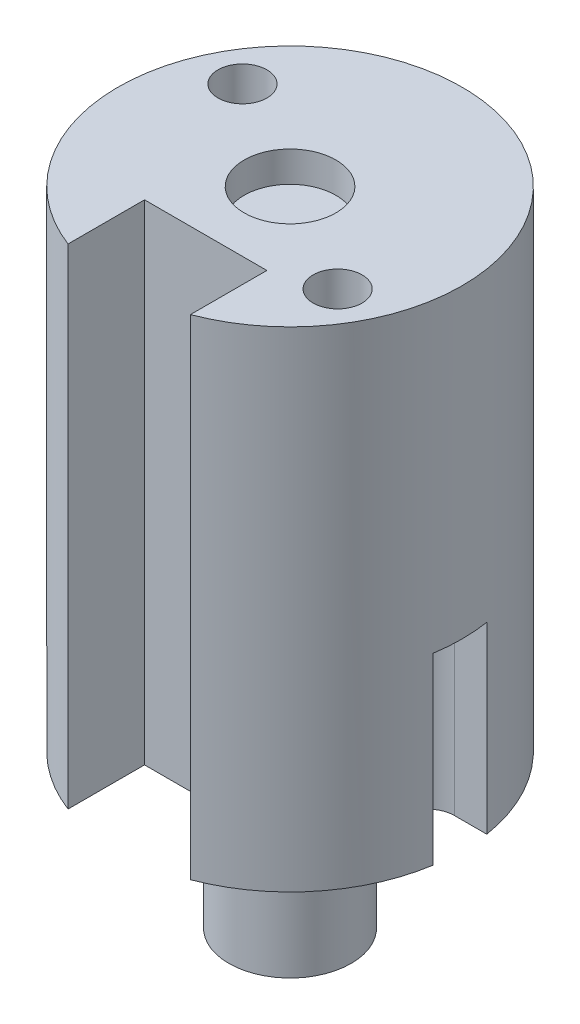
ISO-10303-21;
HEADER;
FILE_DESCRIPTION(('STEP AP214'),'2;1');
FILE_NAME('part.step','',(''),(''),'','','');
FILE_SCHEMA(('AUTOMOTIVE_DESIGN { 1 0 10303 214 1 1 1 1 }'));
ENDSEC;
DATA;
#1=APPLICATION_CONTEXT('core data for automotive mechanical design processes');
#2=APPLICATION_PROTOCOL_DEFINITION('international standard','automotive_design',2000,#1);
#3=PRODUCT_CONTEXT('',#1,'mechanical');
#4=PRODUCT('Part','Part','',(#3));
#5=PRODUCT_RELATED_PRODUCT_CATEGORY('part','',(#4));
#6=PRODUCT_DEFINITION_FORMATION('','',#4);
#7=PRODUCT_DEFINITION_CONTEXT('part definition',#1,'design');
#8=PRODUCT_DEFINITION('design','',#6,#7);
#9=PRODUCT_DEFINITION_SHAPE('','',#8);
#10=(LENGTH_UNIT() NAMED_UNIT(*) SI_UNIT(.MILLI.,.METRE.));
#11=(NAMED_UNIT(*) PLANE_ANGLE_UNIT() SI_UNIT($,.RADIAN.));
#12=(NAMED_UNIT(*) SI_UNIT($,.STERADIAN.) SOLID_ANGLE_UNIT());
#13=UNCERTAINTY_MEASURE_WITH_UNIT(LENGTH_MEASURE(1.E-05),#10,'distance_accuracy_value','');
#14=(GEOMETRIC_REPRESENTATION_CONTEXT(3) GLOBAL_UNCERTAINTY_ASSIGNED_CONTEXT((#13)) GLOBAL_UNIT_ASSIGNED_CONTEXT((#10,
#11,#12)) REPRESENTATION_CONTEXT('',''));
#15=CARTESIAN_POINT('',(0.,0.,0.));
#16=DIRECTION('',(0.,0.,1.));
#17=DIRECTION('',(1.,0.,0.));
#18=AXIS2_PLACEMENT_3D('',#15,#16,#17);
#19=CARTESIAN_POINT('',(0.,32.,0.));
#20=DIRECTION('',(0.,-1.,0.));
#21=DIRECTION('',(0.,0.,-1.));
#22=AXIS2_PLACEMENT_3D('',#19,#20,#21);
#23=CYLINDRICAL_SURFACE('',#22,11.25);
#24=CARTESIAN_POINT('',(0.,0.,0.));
#25=DIRECTION('',(0.,1.,0.));
#26=DIRECTION('',(0.,0.,1.));
#27=AXIS2_PLACEMENT_3D('',#24,#25,#26);
#28=CIRCLE('',#27,11.25);
#29=CARTESIAN_POINT('',(11.1130553854464,0.,-1.75));
#30=VERTEX_POINT('',#29);
#31=CARTESIAN_POINT('',(-11.1130553854464,0.,-1.75));
#32=VERTEX_POINT('',#31);
#33=EDGE_CURVE('E328',#30,#32,#28,.T.);
#34=ORIENTED_EDGE('',*,*,#33,.T.);
#35=DIRECTION('',(0.,-1.,0.));
#36=VECTOR('',#35,1.);
#37=CARTESIAN_POINT('',(-11.1130553854464,12.,-1.75));
#38=LINE('',#37,#36);
#39=CARTESIAN_POINT('',(-11.1130553854464,12.,-1.75));
#40=VERTEX_POINT('',#39);
#41=EDGE_CURVE('E198',#40,#32,#38,.T.);
#42=ORIENTED_EDGE('',*,*,#41,.F.);
#43=CARTESIAN_POINT('',(0.,12.,0.));
#44=DIRECTION('',(0.,-1.,0.));
#45=DIRECTION('',(0.,0.,-1.));
#46=AXIS2_PLACEMENT_3D('',#43,#44,#45);
#47=CIRCLE('',#46,11.25);
#48=CARTESIAN_POINT('',(-11.1130553854464,12.,1.75));
#49=VERTEX_POINT('',#48);
#50=EDGE_CURVE('E170',#49,#40,#47,.T.);
#51=ORIENTED_EDGE('',*,*,#50,.F.);
#52=DIRECTION('',(0.,-1.,0.));
#53=VECTOR('',#52,1.);
#54=CARTESIAN_POINT('',(-11.1130553854464,12.,1.75));
#55=LINE('',#54,#53);
#56=CARTESIAN_POINT('',(-11.1130553854464,0.,1.75));
#57=VERTEX_POINT('',#56);
#58=EDGE_CURVE('E166',#49,#57,#55,.T.);
#59=ORIENTED_EDGE('',*,*,#58,.T.);
#60=CARTESIAN_POINT('',(-4.,0.,10.5148704224065));
#61=VERTEX_POINT('',#60);
#62=EDGE_CURVE('E318',#57,#61,#28,.T.);
#63=ORIENTED_EDGE('',*,*,#62,.T.);
#64=DIRECTION('',(0.,1.,0.));
#65=VECTOR('',#64,1.);
#66=CARTESIAN_POINT('',(-4.,-10.,10.5148704224065));
#67=LINE('',#66,#65);
#68=CARTESIAN_POINT('',(-4.,32.,10.5148704224065));
#69=VERTEX_POINT('',#68);
#70=EDGE_CURVE('E258',#61,#69,#67,.T.);
#71=ORIENTED_EDGE('',*,*,#70,.T.);
#72=CARTESIAN_POINT('',(0.,32.,0.));
#73=DIRECTION('',(0.,1.,0.));
#74=DIRECTION('',(0.,0.,1.));
#75=AXIS2_PLACEMENT_3D('',#72,#73,#74);
#76=CIRCLE('',#75,11.25);
#77=CARTESIAN_POINT('',(4.,32.,10.5148704224065));
#78=VERTEX_POINT('',#77);
#79=EDGE_CURVE('E321',#78,#69,#76,.T.);
#80=ORIENTED_EDGE('',*,*,#79,.F.);
#81=DIRECTION('',(0.,1.,0.));
#82=VECTOR('',#81,1.);
#83=CARTESIAN_POINT('',(4.,-10.,10.5148704224065));
#84=LINE('',#83,#82);
#85=CARTESIAN_POINT('',(4.,0.,10.5148704224065));
#86=VERTEX_POINT('',#85);
#87=EDGE_CURVE('E255',#86,#78,#84,.T.);
#88=ORIENTED_EDGE('',*,*,#87,.F.);
#89=CARTESIAN_POINT('',(11.1130553854464,0.,1.75));
#90=VERTEX_POINT('',#89);
#91=EDGE_CURVE('E325',#86,#90,#28,.T.);
#92=ORIENTED_EDGE('',*,*,#91,.T.);
#93=DIRECTION('',(0.,-1.,0.));
#94=VECTOR('',#93,1.);
#95=CARTESIAN_POINT('',(11.1130553854464,12.,1.75));
#96=LINE('',#95,#94);
#97=CARTESIAN_POINT('',(11.1130553854464,12.,1.75));
#98=VERTEX_POINT('',#97);
#99=EDGE_CURVE('E223',#98,#90,#96,.T.);
#100=ORIENTED_EDGE('',*,*,#99,.F.);
#101=CARTESIAN_POINT('',(0.,12.,0.));
#102=DIRECTION('',(0.,-1.,0.));
#103=DIRECTION('',(0.,0.,-1.));
#104=AXIS2_PLACEMENT_3D('',#101,#102,#103);
#105=CIRCLE('',#104,11.25);
#106=CARTESIAN_POINT('',(11.1130553854464,12.,-1.75));
#107=VERTEX_POINT('',#106);
#108=EDGE_CURVE('E207',#107,#98,#105,.T.);
#109=ORIENTED_EDGE('',*,*,#108,.F.);
#110=DIRECTION('',(0.,-1.,0.));
#111=VECTOR('',#110,1.);
#112=CARTESIAN_POINT('',(11.1130553854464,12.,-1.75));
#113=LINE('',#112,#111);
#114=EDGE_CURVE('E225',#107,#30,#113,.T.);
#115=ORIENTED_EDGE('',*,*,#114,.T.);
#116=EDGE_LOOP('',(#34,#42,#51,#59,#63,#71,#80,#88,#92,#100,#109,#115));
#117=FACE_BOUND('',#116,.T.);
#118=ADVANCED_FACE('F35',(#117),#23,.T.);
#119=CARTESIAN_POINT('',(0.,32.,0.));
#120=DIRECTION('',(0.,1.,0.));
#121=DIRECTION('',(0.,0.,1.));
#122=AXIS2_PLACEMENT_3D('',#119,#120,#121);
#123=PLANE('',#122);
#124=CARTESIAN_POINT('',(0.,32.,0.));
#125=DIRECTION('',(0.,1.,0.));
#126=DIRECTION('',(0.,0.,1.));
#127=AXIS2_PLACEMENT_3D('',#124,#125,#126);
#128=CIRCLE('',#127,3.);
#129=CARTESIAN_POINT('',(0.,32.,3.));
#130=VERTEX_POINT('',#129);
#131=EDGE_CURVE('E197',#130,#130,#128,.T.);
#132=ORIENTED_EDGE('',*,*,#131,.F.);
#133=EDGE_LOOP('',(#132));
#134=FACE_BOUND('',#133,.T.);
#135=CARTESIAN_POINT('',(-7.36121593216774,32.,-4.24999999999998));
#136=DIRECTION('',(0.,1.,0.));
#137=DIRECTION('',(0.,0.,1.));
#138=AXIS2_PLACEMENT_3D('',#135,#136,#137);
#139=CIRCLE('',#138,1.6);
#140=CARTESIAN_POINT('',(-7.36121593216774,32.,-2.64999999999998));
#141=VERTEX_POINT('',#140);
#142=EDGE_CURVE('E239',#141,#141,#139,.T.);
#143=ORIENTED_EDGE('',*,*,#142,.F.);
#144=EDGE_LOOP('',(#143));
#145=FACE_BOUND('',#144,.T.);
#146=CARTESIAN_POINT('',(7.36121593216774,32.,4.24999999999998));
#147=DIRECTION('',(0.,1.,0.));
#148=DIRECTION('',(0.,0.,-1.));
#149=AXIS2_PLACEMENT_3D('',#146,#147,#148);
#150=CIRCLE('',#149,1.6);
#151=CARTESIAN_POINT('',(7.36121593216774,32.,2.64999999999998));
#152=VERTEX_POINT('',#151);
#153=EDGE_CURVE('E232',#152,#152,#150,.T.);
#154=ORIENTED_EDGE('',*,*,#153,.F.);
#155=EDGE_LOOP('',(#154));
#156=FACE_BOUND('',#155,.T.);
#157=DIRECTION('',(1.,0.,0.));
#158=VECTOR('',#157,1.);
#159=CARTESIAN_POINT('',(0.,32.,5.51487042240655));
#160=LINE('',#159,#158);
#161=CARTESIAN_POINT('',(-4.,32.,5.51487042240655));
#162=VERTEX_POINT('',#161);
#163=CARTESIAN_POINT('',(4.,32.,5.51487042240655));
#164=VERTEX_POINT('',#163);
#165=EDGE_CURVE('E249',#162,#164,#160,.T.);
#166=ORIENTED_EDGE('',*,*,#165,.T.);
#167=DIRECTION('',(0.,0.,1.));
#168=VECTOR('',#167,1.);
#169=CARTESIAN_POINT('',(4.,32.,0.));
#170=LINE('',#169,#168);
#171=EDGE_CURVE('E238',#164,#78,#170,.T.);
#172=ORIENTED_EDGE('',*,*,#171,.T.);
#173=ORIENTED_EDGE('',*,*,#79,.T.);
#174=DIRECTION('',(0.,0.,1.));
#175=VECTOR('',#174,1.);
#176=CARTESIAN_POINT('',(-4.,32.,0.));
#177=LINE('',#176,#175);
#178=EDGE_CURVE('E252',#162,#69,#177,.T.);
#179=ORIENTED_EDGE('',*,*,#178,.F.);
#180=EDGE_LOOP('',(#166,#172,#173,#179));
#181=FACE_BOUND('',#180,.T.);
#182=ADVANCED_FACE('F352',(#134,#145,#156,#181),#123,.T.);
#183=CARTESIAN_POINT('',(0.,0.,0.));
#184=DIRECTION('',(0.,1.,0.));
#185=DIRECTION('',(0.,0.,1.));
#186=AXIS2_PLACEMENT_3D('',#183,#184,#185);
#187=PLANE('',#186);
#188=CARTESIAN_POINT('',(0.,0.,0.));
#189=DIRECTION('',(0.,1.,0.));
#190=DIRECTION('',(0.,0.,1.));
#191=AXIS2_PLACEMENT_3D('',#188,#189,#190);
#192=CIRCLE('',#191,4.99999999999999);
#193=CARTESIAN_POINT('',(0.,0.,4.99999999999999));
#194=VERTEX_POINT('',#193);
#195=EDGE_CURVE('E331',#194,#194,#192,.T.);
#196=ORIENTED_EDGE('',*,*,#195,.T.);
#197=EDGE_LOOP('',(#196));
#198=FACE_BOUND('',#197,.T.);
#199=CARTESIAN_POINT('',(-9.,0.,0.));
#200=DIRECTION('',(0.,-1.,0.));
#201=DIRECTION('',(0.,0.,-1.));
#202=AXIS2_PLACEMENT_3D('',#199,#200,#201);
#203=CIRCLE('',#202,1.75);
#204=CARTESIAN_POINT('',(-9.,0.,-1.75));
#205=VERTEX_POINT('',#204);
#206=CARTESIAN_POINT('',(-9.,0.,1.75));
#207=VERTEX_POINT('',#206);
#208=EDGE_CURVE('E51',#205,#207,#203,.T.);
#209=ORIENTED_EDGE('',*,*,#208,.F.);
#210=DIRECTION('',(1.,0.,0.));
#211=VECTOR('',#210,1.);
#212=CARTESIAN_POINT('',(0.,0.,-1.75));
#213=LINE('',#212,#211);
#214=EDGE_CURVE('E182',#32,#205,#213,.T.);
#215=ORIENTED_EDGE('',*,*,#214,.F.);
#216=ORIENTED_EDGE('',*,*,#33,.F.);
#217=DIRECTION('',(-1.,0.,0.));
#218=VECTOR('',#217,1.);
#219=CARTESIAN_POINT('',(0.,0.,-1.75));
#220=LINE('',#219,#218);
#221=CARTESIAN_POINT('',(9.,0.,-1.75));
#222=VERTEX_POINT('',#221);
#223=EDGE_CURVE('E217',#30,#222,#220,.T.);
#224=ORIENTED_EDGE('',*,*,#223,.T.);
#225=CARTESIAN_POINT('',(9.,0.,0.));
#226=DIRECTION('',(0.,-1.,0.));
#227=DIRECTION('',(0.,0.,-1.));
#228=AXIS2_PLACEMENT_3D('',#225,#226,#227);
#229=CIRCLE('',#228,1.75);
#230=CARTESIAN_POINT('',(9.,0.,1.75));
#231=VERTEX_POINT('',#230);
#232=EDGE_CURVE('E59',#231,#222,#229,.T.);
#233=ORIENTED_EDGE('',*,*,#232,.F.);
#234=DIRECTION('',(-1.,0.,0.));
#235=VECTOR('',#234,1.);
#236=CARTESIAN_POINT('',(0.,0.,1.75));
#237=LINE('',#236,#235);
#238=EDGE_CURVE('E205',#90,#231,#237,.T.);
#239=ORIENTED_EDGE('',*,*,#238,.F.);
#240=ORIENTED_EDGE('',*,*,#91,.F.);
#241=DIRECTION('',(0.,0.,1.));
#242=VECTOR('',#241,1.);
#243=CARTESIAN_POINT('',(4.,0.,0.));
#244=LINE('',#243,#242);
#245=CARTESIAN_POINT('',(4.,0.,5.51487042240655));
#246=VERTEX_POINT('',#245);
#247=EDGE_CURVE('E11',#246,#86,#244,.T.);
#248=ORIENTED_EDGE('',*,*,#247,.F.);
#249=DIRECTION('',(1.,0.,0.));
#250=VECTOR('',#249,1.);
#251=CARTESIAN_POINT('',(0.,0.,5.51487042240655));
#252=LINE('',#251,#250);
#253=CARTESIAN_POINT('',(-4.,0.,5.51487042240655));
#254=VERTEX_POINT('',#253);
#255=EDGE_CURVE('E334',#254,#246,#252,.T.);
#256=ORIENTED_EDGE('',*,*,#255,.F.);
#257=DIRECTION('',(0.,0.,1.));
#258=VECTOR('',#257,1.);
#259=CARTESIAN_POINT('',(-4.,0.,0.));
#260=LINE('',#259,#258);
#261=EDGE_CURVE('E44',#254,#61,#260,.T.);
#262=ORIENTED_EDGE('',*,*,#261,.T.);
#263=ORIENTED_EDGE('',*,*,#62,.F.);
#264=DIRECTION('',(1.,0.,0.));
#265=VECTOR('',#264,1.);
#266=CARTESIAN_POINT('',(0.,0.,1.75));
#267=LINE('',#266,#265);
#268=EDGE_CURVE('E185',#57,#207,#267,.T.);
#269=ORIENTED_EDGE('',*,*,#268,.T.);
#270=EDGE_LOOP('',(#209,#215,#216,#224,#233,#239,#240,#248,#256,#262,#263,#269));
#271=FACE_BOUND('',#270,.T.);
#272=ADVANCED_FACE('F340',(#198,#271),#187,.F.);
#273=CARTESIAN_POINT('',(0.,-10.,0.));
#274=DIRECTION('',(0.,1.,0.));
#275=DIRECTION('',(0.,0.,1.));
#276=AXIS2_PLACEMENT_3D('',#273,#274,#275);
#277=CYLINDRICAL_SURFACE('',#276,4.);
#278=CARTESIAN_POINT('',(0.,-0.999999999999997,0.));
#279=DIRECTION('',(0.,1.,0.));
#280=DIRECTION('',(0.,0.,1.));
#281=AXIS2_PLACEMENT_3D('',#278,#279,#280);
#282=CIRCLE('',#281,4.);
#283=CARTESIAN_POINT('',(0.,-0.999999999999997,4.));
#284=VERTEX_POINT('',#283);
#285=EDGE_CURVE('E324',#284,#284,#282,.F.);
#286=ORIENTED_EDGE('',*,*,#285,.T.);
#287=EDGE_LOOP('',(#286));
#288=FACE_BOUND('',#287,.T.);
#289=CARTESIAN_POINT('',(0.,-10.,0.));
#290=DIRECTION('',(0.,-1.,0.));
#291=DIRECTION('',(0.,0.,-1.));
#292=AXIS2_PLACEMENT_3D('',#289,#290,#291);
#293=CIRCLE('',#292,4.);
#294=CARTESIAN_POINT('',(0.,-10.,-4.));
#295=VERTEX_POINT('',#294);
#296=EDGE_CURVE('E301',#295,#295,#293,.T.);
#297=ORIENTED_EDGE('',*,*,#296,.F.);
#298=EDGE_LOOP('',(#297));
#299=FACE_BOUND('',#298,.T.);
#300=ADVANCED_FACE('F393',(#288,#299),#277,.T.);
#301=CARTESIAN_POINT('',(0.,-10.,0.));
#302=DIRECTION('',(0.,-1.,0.));
#303=DIRECTION('',(0.,0.,-1.));
#304=AXIS2_PLACEMENT_3D('',#301,#302,#303);
#305=PLANE('',#304);
#306=DIRECTION('',(0.866025403784439,0.,-0.5));
#307=VECTOR('',#306,1.);
#308=CARTESIAN_POINT('',(-2.52,-10.,-1.45492267835786));
#309=LINE('',#308,#307);
#310=CARTESIAN_POINT('',(-2.52,-10.,-1.45492267835786));
#311=VERTEX_POINT('',#310);
#312=CARTESIAN_POINT('',(0.,-10.,-2.90984535671571));
#313=VERTEX_POINT('',#312);
#314=EDGE_CURVE('E257',#311,#313,#309,.T.);
#315=ORIENTED_EDGE('',*,*,#314,.F.);
#316=DIRECTION('',(0.,0.,-1.));
#317=VECTOR('',#316,1.);
#318=CARTESIAN_POINT('',(-2.52,-10.,1.45492267835786));
#319=LINE('',#318,#317);
#320=CARTESIAN_POINT('',(-2.52,-10.,1.45492267835786));
#321=VERTEX_POINT('',#320);
#322=EDGE_CURVE('E268',#321,#311,#319,.T.);
#323=ORIENTED_EDGE('',*,*,#322,.F.);
#324=DIRECTION('',(-0.866025403784439,0.,-0.5));
#325=VECTOR('',#324,1.);
#326=CARTESIAN_POINT('',(0.,-10.,2.90984535671571));
#327=LINE('',#326,#325);
#328=CARTESIAN_POINT('',(0.,-10.,2.90984535671571));
#329=VERTEX_POINT('',#328);
#330=EDGE_CURVE('E294',#329,#321,#327,.T.);
#331=ORIENTED_EDGE('',*,*,#330,.F.);
#332=DIRECTION('',(-0.866025403784439,0.,0.5));
#333=VECTOR('',#332,1.);
#334=CARTESIAN_POINT('',(2.52,-10.,1.45492267835786));
#335=LINE('',#334,#333);
#336=CARTESIAN_POINT('',(2.52,-10.,1.45492267835786));
#337=VERTEX_POINT('',#336);
#338=EDGE_CURVE('E291',#337,#329,#335,.T.);
#339=ORIENTED_EDGE('',*,*,#338,.F.);
#340=DIRECTION('',(0.,0.,1.));
#341=VECTOR('',#340,1.);
#342=CARTESIAN_POINT('',(2.52,-10.,-1.45492267835786));
#343=LINE('',#342,#341);
#344=CARTESIAN_POINT('',(2.52,-10.,-1.45492267835786));
#345=VERTEX_POINT('',#344);
#346=EDGE_CURVE('E288',#345,#337,#343,.T.);
#347=ORIENTED_EDGE('',*,*,#346,.F.);
#348=DIRECTION('',(0.866025403784439,0.,0.5));
#349=VECTOR('',#348,1.);
#350=CARTESIAN_POINT('',(0.,-10.,-2.90984535671571));
#351=LINE('',#350,#349);
#352=EDGE_CURVE('E285',#313,#345,#351,.T.);
#353=ORIENTED_EDGE('',*,*,#352,.F.);
#354=EDGE_LOOP('',(#315,#323,#331,#339,#347,#353));
#355=FACE_BOUND('',#354,.T.);
#356=ORIENTED_EDGE('',*,*,#296,.T.);
#357=EDGE_LOOP('',(#356));
#358=FACE_BOUND('',#357,.T.);
#359=ADVANCED_FACE('F414',(#355,#358),#305,.T.);
#360=CARTESIAN_POINT('',(-2.52,0.,-1.45492267835786));
#361=DIRECTION('',(-0.5,0.,-0.866025403784439));
#362=DIRECTION('',(-0.866025403784439,0.,0.5));
#363=AXIS2_PLACEMENT_3D('',#360,#361,#362);
#364=PLANE('',#363);
#365=ORIENTED_EDGE('',*,*,#314,.T.);
#366=DIRECTION('',(0.,-1.,0.));
#367=VECTOR('',#366,1.);
#368=CARTESIAN_POINT('',(0.,0.,-2.90984535671571));
#369=LINE('',#368,#367);
#370=CARTESIAN_POINT('',(0.,0.,-2.90984535671571));
#371=VERTEX_POINT('',#370);
#372=EDGE_CURVE('E283',#371,#313,#369,.T.);
#373=ORIENTED_EDGE('',*,*,#372,.F.);
#374=DIRECTION('',(0.866025403784439,0.,-0.5));
#375=VECTOR('',#374,1.);
#376=CARTESIAN_POINT('',(-2.52,0.,-1.45492267835786));
#377=LINE('',#376,#375);
#378=CARTESIAN_POINT('',(-2.52,0.,-1.45492267835786));
#379=VERTEX_POINT('',#378);
#380=EDGE_CURVE('E264',#379,#371,#377,.T.);
#381=ORIENTED_EDGE('',*,*,#380,.F.);
#382=DIRECTION('',(0.,-1.,0.));
#383=VECTOR('',#382,1.);
#384=CARTESIAN_POINT('',(-2.52,0.,-1.45492267835786));
#385=LINE('',#384,#383);
#386=EDGE_CURVE('E299',#379,#311,#385,.T.);
#387=ORIENTED_EDGE('',*,*,#386,.T.);
#388=EDGE_LOOP('',(#365,#373,#381,#387));
#389=FACE_BOUND('',#388,.T.);
#390=ADVANCED_FACE('F418',(#389),#364,.F.);
#391=CARTESIAN_POINT('',(-2.52,0.,1.45492267835786));
#392=DIRECTION('',(-1.,0.,0.));
#393=DIRECTION('',(0.,0.,1.));
#394=AXIS2_PLACEMENT_3D('',#391,#392,#393);
#395=PLANE('',#394);
#396=ORIENTED_EDGE('',*,*,#322,.T.);
#397=ORIENTED_EDGE('',*,*,#386,.F.);
#398=DIRECTION('',(0.,0.,-1.));
#399=VECTOR('',#398,1.);
#400=CARTESIAN_POINT('',(-2.52,0.,1.45492267835786));
#401=LINE('',#400,#399);
#402=CARTESIAN_POINT('',(-2.52,0.,1.45492267835786));
#403=VERTEX_POINT('',#402);
#404=EDGE_CURVE('E280',#403,#379,#401,.T.);
#405=ORIENTED_EDGE('',*,*,#404,.F.);
#406=DIRECTION('',(0.,-1.,0.));
#407=VECTOR('',#406,1.);
#408=CARTESIAN_POINT('',(-2.52,0.,1.45492267835786));
#409=LINE('',#408,#407);
#410=EDGE_CURVE('E302',#403,#321,#409,.T.);
#411=ORIENTED_EDGE('',*,*,#410,.T.);
#412=EDGE_LOOP('',(#396,#397,#405,#411));
#413=FACE_BOUND('',#412,.T.);
#414=ADVANCED_FACE('F422',(#413),#395,.F.);
#415=CARTESIAN_POINT('',(0.,0.,2.90984535671571));
#416=DIRECTION('',(-0.5,0.,0.866025403784439));
#417=DIRECTION('',(0.866025403784439,0.,0.5));
#418=AXIS2_PLACEMENT_3D('',#415,#416,#417);
#419=PLANE('',#418);
#420=ORIENTED_EDGE('',*,*,#330,.T.);
#421=ORIENTED_EDGE('',*,*,#410,.F.);
#422=DIRECTION('',(-0.866025403784439,0.,-0.5));
#423=VECTOR('',#422,1.);
#424=CARTESIAN_POINT('',(0.,0.,2.90984535671571));
#425=LINE('',#424,#423);
#426=CARTESIAN_POINT('',(0.,0.,2.90984535671571));
#427=VERTEX_POINT('',#426);
#428=EDGE_CURVE('E277',#427,#403,#425,.T.);
#429=ORIENTED_EDGE('',*,*,#428,.F.);
#430=DIRECTION('',(0.,-1.,0.));
#431=VECTOR('',#430,1.);
#432=CARTESIAN_POINT('',(0.,0.,2.90984535671571));
#433=LINE('',#432,#431);
#434=EDGE_CURVE('E304',#427,#329,#433,.T.);
#435=ORIENTED_EDGE('',*,*,#434,.T.);
#436=EDGE_LOOP('',(#420,#421,#429,#435));
#437=FACE_BOUND('',#436,.T.);
#438=ADVANCED_FACE('F436',(#437),#419,.F.);
#439=CARTESIAN_POINT('',(2.52,0.,1.45492267835786));
#440=DIRECTION('',(0.5,0.,0.866025403784439));
#441=DIRECTION('',(0.866025403784439,0.,-0.5));
#442=AXIS2_PLACEMENT_3D('',#439,#440,#441);
#443=PLANE('',#442);
#444=ORIENTED_EDGE('',*,*,#338,.T.);
#445=ORIENTED_EDGE('',*,*,#434,.F.);
#446=DIRECTION('',(-0.866025403784439,0.,0.5));
#447=VECTOR('',#446,1.);
#448=CARTESIAN_POINT('',(2.52,0.,1.45492267835786));
#449=LINE('',#448,#447);
#450=CARTESIAN_POINT('',(2.52,0.,1.45492267835786));
#451=VERTEX_POINT('',#450);
#452=EDGE_CURVE('E274',#451,#427,#449,.T.);
#453=ORIENTED_EDGE('',*,*,#452,.F.);
#454=DIRECTION('',(0.,-1.,0.));
#455=VECTOR('',#454,1.);
#456=CARTESIAN_POINT('',(2.52,0.,1.45492267835786));
#457=LINE('',#456,#455);
#458=EDGE_CURVE('E306',#451,#337,#457,.T.);
#459=ORIENTED_EDGE('',*,*,#458,.T.);
#460=EDGE_LOOP('',(#444,#445,#453,#459));
#461=FACE_BOUND('',#460,.T.);
#462=ADVANCED_FACE('F432',(#461),#443,.F.);
#463=CARTESIAN_POINT('',(2.52,0.,-1.45492267835786));
#464=DIRECTION('',(1.,0.,0.));
#465=DIRECTION('',(0.,0.,-1.));
#466=AXIS2_PLACEMENT_3D('',#463,#464,#465);
#467=PLANE('',#466);
#468=ORIENTED_EDGE('',*,*,#346,.T.);
#469=ORIENTED_EDGE('',*,*,#458,.F.);
#470=DIRECTION('',(0.,0.,1.));
#471=VECTOR('',#470,1.);
#472=CARTESIAN_POINT('',(2.52,0.,-1.45492267835786));
#473=LINE('',#472,#471);
#474=CARTESIAN_POINT('',(2.52,0.,-1.45492267835786));
#475=VERTEX_POINT('',#474);
#476=EDGE_CURVE('E271',#475,#451,#473,.T.);
#477=ORIENTED_EDGE('',*,*,#476,.F.);
#478=DIRECTION('',(0.,-1.,0.));
#479=VECTOR('',#478,1.);
#480=CARTESIAN_POINT('',(2.52,0.,-1.45492267835786));
#481=LINE('',#480,#479);
#482=EDGE_CURVE('E308',#475,#345,#481,.T.);
#483=ORIENTED_EDGE('',*,*,#482,.T.);
#484=EDGE_LOOP('',(#468,#469,#477,#483));
#485=FACE_BOUND('',#484,.T.);
#486=ADVANCED_FACE('F428',(#485),#467,.F.);
#487=CARTESIAN_POINT('',(0.,0.,-2.90984535671571));
#488=DIRECTION('',(0.5,0.,-0.866025403784439));
#489=DIRECTION('',(-0.866025403784439,0.,-0.5));
#490=AXIS2_PLACEMENT_3D('',#487,#488,#489);
#491=PLANE('',#490);
#492=ORIENTED_EDGE('',*,*,#352,.T.);
#493=ORIENTED_EDGE('',*,*,#482,.F.);
#494=DIRECTION('',(0.866025403784439,0.,0.5));
#495=VECTOR('',#494,1.);
#496=CARTESIAN_POINT('',(0.,0.,-2.90984535671571));
#497=LINE('',#496,#495);
#498=EDGE_CURVE('E267',#371,#475,#497,.T.);
#499=ORIENTED_EDGE('',*,*,#498,.F.);
#500=ORIENTED_EDGE('',*,*,#372,.T.);
#501=EDGE_LOOP('',(#492,#493,#499,#500));
#502=FACE_BOUND('',#501,.T.);
#503=ADVANCED_FACE('F424',(#502),#491,.F.);
#504=CARTESIAN_POINT('',(0.,0.,0.));
#505=DIRECTION('',(0.,-1.,0.));
#506=DIRECTION('',(0.,0.,-1.));
#507=AXIS2_PLACEMENT_3D('',#504,#505,#506);
#508=PLANE('',#507);
#509=ORIENTED_EDGE('',*,*,#380,.T.);
#510=ORIENTED_EDGE('',*,*,#498,.T.);
#511=ORIENTED_EDGE('',*,*,#476,.T.);
#512=ORIENTED_EDGE('',*,*,#452,.T.);
#513=ORIENTED_EDGE('',*,*,#428,.T.);
#514=ORIENTED_EDGE('',*,*,#404,.T.);
#515=EDGE_LOOP('',(#509,#510,#511,#512,#513,#514));
#516=FACE_BOUND('',#515,.T.);
#517=ADVANCED_FACE('F427',(#516),#508,.T.);
#518=CARTESIAN_POINT('',(0.,-0.999999999999997,0.));
#519=DIRECTION('',(0.,1.,0.));
#520=DIRECTION('',(0.,0.,1.));
#521=AXIS2_PLACEMENT_3D('',#518,#519,#520);
#522=CONICAL_SURFACE('',#521,4.,0.785398163397445);
#523=ORIENTED_EDGE('',*,*,#195,.F.);
#524=EDGE_LOOP('',(#523));
#525=FACE_BOUND('',#524,.T.);
#526=ORIENTED_EDGE('',*,*,#285,.F.);
#527=EDGE_LOOP('',(#526));
#528=FACE_BOUND('',#527,.T.);
#529=ADVANCED_FACE('F38',(#525,#528),#522,.T.);
#530=CARTESIAN_POINT('',(4.,-10.,0.));
#531=DIRECTION('',(-1.,0.,0.));
#532=DIRECTION('',(0.,0.,1.));
#533=AXIS2_PLACEMENT_3D('',#530,#531,#532);
#534=PLANE('',#533);
#535=ORIENTED_EDGE('',*,*,#247,.T.);
#536=ORIENTED_EDGE('',*,*,#87,.T.);
#537=ORIENTED_EDGE('',*,*,#171,.F.);
#538=DIRECTION('',(0.,1.,0.));
#539=VECTOR('',#538,1.);
#540=CARTESIAN_POINT('',(4.,-10.,5.51487042240655));
#541=LINE('',#540,#539);
#542=EDGE_CURVE('E254',#246,#164,#541,.T.);
#543=ORIENTED_EDGE('',*,*,#542,.F.);
#544=EDGE_LOOP('',(#535,#536,#537,#543));
#545=FACE_BOUND('',#544,.T.);
#546=ADVANCED_FACE('F356',(#545),#534,.T.);
#547=CARTESIAN_POINT('',(-4.,-10.,0.));
#548=DIRECTION('',(-1.,0.,0.));
#549=DIRECTION('',(0.,0.,1.));
#550=AXIS2_PLACEMENT_3D('',#547,#548,#549);
#551=PLANE('',#550);
#552=DIRECTION('',(0.,1.,0.));
#553=VECTOR('',#552,1.);
#554=CARTESIAN_POINT('',(-4.,-10.,5.51487042240655));
#555=LINE('',#554,#553);
#556=EDGE_CURVE('E261',#254,#162,#555,.T.);
#557=ORIENTED_EDGE('',*,*,#556,.T.);
#558=ORIENTED_EDGE('',*,*,#178,.T.);
#559=ORIENTED_EDGE('',*,*,#70,.F.);
#560=ORIENTED_EDGE('',*,*,#261,.F.);
#561=EDGE_LOOP('',(#557,#558,#559,#560));
#562=FACE_BOUND('',#561,.T.);
#563=ADVANCED_FACE('F344',(#562),#551,.F.);
#564=CARTESIAN_POINT('',(0.,-10.,5.51487042240655));
#565=DIRECTION('',(0.,0.,1.));
#566=DIRECTION('',(1.,0.,0.));
#567=AXIS2_PLACEMENT_3D('',#564,#565,#566);
#568=PLANE('',#567);
#569=ORIENTED_EDGE('',*,*,#255,.T.);
#570=ORIENTED_EDGE('',*,*,#542,.T.);
#571=ORIENTED_EDGE('',*,*,#165,.F.);
#572=ORIENTED_EDGE('',*,*,#556,.F.);
#573=EDGE_LOOP('',(#569,#570,#571,#572));
#574=FACE_BOUND('',#573,.T.);
#575=ADVANCED_FACE('F449',(#574),#568,.T.);
#576=CARTESIAN_POINT('',(7.36121593216774,26.,4.24999999999998));
#577=DIRECTION('',(0.,1.,0.));
#578=DIRECTION('',(0.,0.,1.));
#579=AXIS2_PLACEMENT_3D('',#576,#577,#578);
#580=CYLINDRICAL_SURFACE('',#579,1.6);
#581=CARTESIAN_POINT('',(7.36121593216774,26.,4.24999999999998));
#582=DIRECTION('',(0.,1.,0.));
#583=DIRECTION('',(0.,0.,-1.));
#584=AXIS2_PLACEMENT_3D('',#581,#582,#583);
#585=CIRCLE('',#584,1.6);
#586=CARTESIAN_POINT('',(7.36121593216774,26.,2.64999999999998));
#587=VERTEX_POINT('',#586);
#588=EDGE_CURVE('E242',#587,#587,#585,.T.);
#589=ORIENTED_EDGE('',*,*,#588,.F.);
#590=EDGE_LOOP('',(#589));
#591=FACE_BOUND('',#590,.T.);
#592=ORIENTED_EDGE('',*,*,#153,.T.);
#593=EDGE_LOOP('',(#592));
#594=FACE_BOUND('',#593,.T.);
#595=ADVANCED_FACE('F452',(#591,#594),#580,.F.);
#596=CARTESIAN_POINT('',(7.36121593216774,26.,4.24999999999998));
#597=DIRECTION('',(0.,-1.,0.));
#598=DIRECTION('',(0.,0.,-1.));
#599=AXIS2_PLACEMENT_3D('',#596,#597,#598);
#600=PLANE('',#599);
#601=ORIENTED_EDGE('',*,*,#588,.T.);
#602=EDGE_LOOP('',(#601));
#603=FACE_BOUND('',#602,.T.);
#604=ADVANCED_FACE('F458',(#603),#600,.F.);
#605=CARTESIAN_POINT('',(-7.36121593216774,26.,-4.24999999999998));
#606=DIRECTION('',(0.,1.,0.));
#607=DIRECTION('',(0.,0.,1.));
#608=AXIS2_PLACEMENT_3D('',#605,#606,#607);
#609=CYLINDRICAL_SURFACE('',#608,1.6);
#610=CARTESIAN_POINT('',(-7.36121593216774,26.,-4.24999999999998));
#611=DIRECTION('',(0.,1.,0.));
#612=DIRECTION('',(0.,0.,1.));
#613=AXIS2_PLACEMENT_3D('',#610,#611,#612);
#614=CIRCLE('',#613,1.6);
#615=CARTESIAN_POINT('',(-7.36121593216774,26.,-2.64999999999998));
#616=VERTEX_POINT('',#615);
#617=EDGE_CURVE('E235',#616,#616,#614,.T.);
#618=ORIENTED_EDGE('',*,*,#617,.F.);
#619=EDGE_LOOP('',(#618));
#620=FACE_BOUND('',#619,.T.);
#621=ORIENTED_EDGE('',*,*,#142,.T.);
#622=EDGE_LOOP('',(#621));
#623=FACE_BOUND('',#622,.T.);
#624=ADVANCED_FACE('F462',(#620,#623),#609,.F.);
#625=CARTESIAN_POINT('',(-7.36121593216774,26.,-4.24999999999998));
#626=DIRECTION('',(0.,1.,0.));
#627=DIRECTION('',(0.,0.,1.));
#628=AXIS2_PLACEMENT_3D('',#625,#626,#627);
#629=PLANE('',#628);
#630=ORIENTED_EDGE('',*,*,#617,.T.);
#631=EDGE_LOOP('',(#630));
#632=FACE_BOUND('',#631,.T.);
#633=ADVANCED_FACE('F466',(#632),#629,.T.);
#634=CARTESIAN_POINT('',(0.,30.,0.));
#635=DIRECTION('',(0.,1.,0.));
#636=DIRECTION('',(0.,0.,1.));
#637=AXIS2_PLACEMENT_3D('',#634,#635,#636);
#638=CYLINDRICAL_SURFACE('',#637,3.);
#639=CARTESIAN_POINT('',(0.,30.,0.));
#640=DIRECTION('',(0.,1.,0.));
#641=DIRECTION('',(0.,0.,1.));
#642=AXIS2_PLACEMENT_3D('',#639,#640,#641);
#643=CIRCLE('',#642,3.);
#644=CARTESIAN_POINT('',(0.,30.,3.));
#645=VERTEX_POINT('',#644);
#646=EDGE_CURVE('E229',#645,#645,#643,.T.);
#647=ORIENTED_EDGE('',*,*,#646,.F.);
#648=EDGE_LOOP('',(#647));
#649=FACE_BOUND('',#648,.T.);
#650=ORIENTED_EDGE('',*,*,#131,.T.);
#651=EDGE_LOOP('',(#650));
#652=FACE_BOUND('',#651,.T.);
#653=ADVANCED_FACE('F381',(#649,#652),#638,.F.);
#654=CARTESIAN_POINT('',(0.,30.,0.));
#655=DIRECTION('',(0.,1.,0.));
#656=DIRECTION('',(0.,0.,1.));
#657=AXIS2_PLACEMENT_3D('',#654,#655,#656);
#658=PLANE('',#657);
#659=ORIENTED_EDGE('',*,*,#646,.T.);
#660=EDGE_LOOP('',(#659));
#661=FACE_BOUND('',#660,.T.);
#662=ADVANCED_FACE('F374',(#661),#658,.T.);
#663=CARTESIAN_POINT('',(9.,12.,0.));
#664=DIRECTION('',(0.,-1.,0.));
#665=DIRECTION('',(0.,0.,-1.));
#666=AXIS2_PLACEMENT_3D('',#663,#664,#665);
#667=CYLINDRICAL_SURFACE('',#666,1.75);
#668=ORIENTED_EDGE('',*,*,#232,.T.);
#669=DIRECTION('',(0.,-1.,0.));
#670=VECTOR('',#669,1.);
#671=CARTESIAN_POINT('',(9.,12.,-1.75));
#672=LINE('',#671,#670);
#673=CARTESIAN_POINT('',(9.,12.,-1.75));
#674=VERTEX_POINT('',#673);
#675=EDGE_CURVE('E215',#674,#222,#672,.T.);
#676=ORIENTED_EDGE('',*,*,#675,.F.);
#677=CARTESIAN_POINT('',(9.,12.,0.));
#678=DIRECTION('',(0.,-1.,0.));
#679=DIRECTION('',(0.,0.,-1.));
#680=AXIS2_PLACEMENT_3D('',#677,#678,#679);
#681=CIRCLE('',#680,1.75);
#682=CARTESIAN_POINT('',(9.,12.,1.75));
#683=VERTEX_POINT('',#682);
#684=EDGE_CURVE('E201',#683,#674,#681,.T.);
#685=ORIENTED_EDGE('',*,*,#684,.F.);
#686=DIRECTION('',(0.,-1.,0.));
#687=VECTOR('',#686,1.);
#688=CARTESIAN_POINT('',(9.,12.,1.75));
#689=LINE('',#688,#687);
#690=EDGE_CURVE('E193',#683,#231,#689,.T.);
#691=ORIENTED_EDGE('',*,*,#690,.T.);
#692=EDGE_LOOP('',(#668,#676,#685,#691));
#693=FACE_BOUND('',#692,.T.);
#694=ADVANCED_FACE('F372',(#693),#667,.F.);
#695=CARTESIAN_POINT('',(0.,12.,1.75));
#696=DIRECTION('',(0.,0.,1.));
#697=DIRECTION('',(1.,0.,0.));
#698=AXIS2_PLACEMENT_3D('',#695,#696,#697);
#699=PLANE('',#698);
#700=ORIENTED_EDGE('',*,*,#238,.T.);
#701=ORIENTED_EDGE('',*,*,#690,.F.);
#702=DIRECTION('',(-1.,0.,0.));
#703=VECTOR('',#702,1.);
#704=CARTESIAN_POINT('',(0.,12.,1.75));
#705=LINE('',#704,#703);
#706=EDGE_CURVE('E209',#98,#683,#705,.T.);
#707=ORIENTED_EDGE('',*,*,#706,.F.);
#708=ORIENTED_EDGE('',*,*,#99,.T.);
#709=EDGE_LOOP('',(#700,#701,#707,#708));
#710=FACE_BOUND('',#709,.T.);
#711=ADVANCED_FACE('F361',(#710),#699,.F.);
#712=CARTESIAN_POINT('',(0.,12.,-1.75));
#713=DIRECTION('',(0.,0.,1.));
#714=DIRECTION('',(1.,0.,0.));
#715=AXIS2_PLACEMENT_3D('',#712,#713,#714);
#716=PLANE('',#715);
#717=ORIENTED_EDGE('',*,*,#223,.F.);
#718=ORIENTED_EDGE('',*,*,#114,.F.);
#719=DIRECTION('',(-1.,0.,0.));
#720=VECTOR('',#719,1.);
#721=CARTESIAN_POINT('',(0.,12.,-1.75));
#722=LINE('',#721,#720);
#723=EDGE_CURVE('E204',#107,#674,#722,.T.);
#724=ORIENTED_EDGE('',*,*,#723,.T.);
#725=ORIENTED_EDGE('',*,*,#675,.T.);
#726=EDGE_LOOP('',(#717,#718,#724,#725));
#727=FACE_BOUND('',#726,.T.);
#728=ADVANCED_FACE('F371',(#727),#716,.T.);
#729=CARTESIAN_POINT('',(0.,12.,0.));
#730=DIRECTION('',(0.,-1.,0.));
#731=DIRECTION('',(0.,0.,-1.));
#732=AXIS2_PLACEMENT_3D('',#729,#730,#731);
#733=PLANE('',#732);
#734=ORIENTED_EDGE('',*,*,#684,.T.);
#735=ORIENTED_EDGE('',*,*,#723,.F.);
#736=ORIENTED_EDGE('',*,*,#108,.T.);
#737=ORIENTED_EDGE('',*,*,#706,.T.);
#738=EDGE_LOOP('',(#734,#735,#736,#737));
#739=FACE_BOUND('',#738,.T.);
#740=CARTESIAN_POINT('',(9.,12.,0.));
#741=DIRECTION('',(0.,-1.,0.));
#742=DIRECTION('',(0.,0.,-1.));
#743=AXIS2_PLACEMENT_3D('',#740,#741,#742);
#744=CIRCLE('',#743,1.21);
#745=CARTESIAN_POINT('',(9.,12.,-1.21));
#746=VERTEX_POINT('',#745);
#747=EDGE_CURVE('E212',#746,#746,#744,.F.);
#748=ORIENTED_EDGE('',*,*,#747,.T.);
#749=EDGE_LOOP('',(#748));
#750=FACE_BOUND('',#749,.T.);
#751=ADVANCED_FACE('F368',(#739,#750),#733,.T.);
#752=CARTESIAN_POINT('',(-9.,12.,0.));
#753=DIRECTION('',(0.,-1.,0.));
#754=DIRECTION('',(0.,0.,-1.));
#755=AXIS2_PLACEMENT_3D('',#752,#753,#754);
#756=CYLINDRICAL_SURFACE('',#755,1.75);
#757=ORIENTED_EDGE('',*,*,#208,.T.);
#758=DIRECTION('',(0.,-1.,0.));
#759=VECTOR('',#758,1.);
#760=CARTESIAN_POINT('',(-9.,12.,1.75));
#761=LINE('',#760,#759);
#762=CARTESIAN_POINT('',(-9.,12.,1.75));
#763=VERTEX_POINT('',#762);
#764=EDGE_CURVE('E163',#763,#207,#761,.T.);
#765=ORIENTED_EDGE('',*,*,#764,.F.);
#766=CARTESIAN_POINT('',(-9.,12.,0.));
#767=DIRECTION('',(0.,-1.,0.));
#768=DIRECTION('',(0.,0.,-1.));
#769=AXIS2_PLACEMENT_3D('',#766,#767,#768);
#770=CIRCLE('',#769,1.75);
#771=CARTESIAN_POINT('',(-9.,12.,-1.75));
#772=VERTEX_POINT('',#771);
#773=EDGE_CURVE('E171',#772,#763,#770,.T.);
#774=ORIENTED_EDGE('',*,*,#773,.F.);
#775=DIRECTION('',(0.,-1.,0.));
#776=VECTOR('',#775,1.);
#777=CARTESIAN_POINT('',(-9.,12.,-1.75));
#778=LINE('',#777,#776);
#779=EDGE_CURVE('E195',#772,#205,#778,.T.);
#780=ORIENTED_EDGE('',*,*,#779,.T.);
#781=EDGE_LOOP('',(#757,#765,#774,#780));
#782=FACE_BOUND('',#781,.T.);
#783=ADVANCED_FACE('F174',(#782),#756,.F.);
#784=CARTESIAN_POINT('',(0.,12.,-1.75));
#785=DIRECTION('',(0.,0.,-1.));
#786=DIRECTION('',(-1.,0.,0.));
#787=AXIS2_PLACEMENT_3D('',#784,#785,#786);
#788=PLANE('',#787);
#789=ORIENTED_EDGE('',*,*,#214,.T.);
#790=ORIENTED_EDGE('',*,*,#779,.F.);
#791=DIRECTION('',(1.,0.,0.));
#792=VECTOR('',#791,1.);
#793=CARTESIAN_POINT('',(0.,12.,-1.75));
#794=LINE('',#793,#792);
#795=EDGE_CURVE('E181',#40,#772,#794,.T.);
#796=ORIENTED_EDGE('',*,*,#795,.F.);
#797=ORIENTED_EDGE('',*,*,#41,.T.);
#798=EDGE_LOOP('',(#789,#790,#796,#797));
#799=FACE_BOUND('',#798,.T.);
#800=ADVANCED_FACE('F542',(#799),#788,.F.);
#801=CARTESIAN_POINT('',(0.,12.,1.75));
#802=DIRECTION('',(0.,0.,-1.));
#803=DIRECTION('',(-1.,0.,0.));
#804=AXIS2_PLACEMENT_3D('',#801,#802,#803);
#805=PLANE('',#804);
#806=ORIENTED_EDGE('',*,*,#268,.F.);
#807=ORIENTED_EDGE('',*,*,#58,.F.);
#808=DIRECTION('',(1.,0.,0.));
#809=VECTOR('',#808,1.);
#810=CARTESIAN_POINT('',(0.,12.,1.75));
#811=LINE('',#810,#809);
#812=EDGE_CURVE('E161',#49,#763,#811,.T.);
#813=ORIENTED_EDGE('',*,*,#812,.T.);
#814=ORIENTED_EDGE('',*,*,#764,.T.);
#815=EDGE_LOOP('',(#806,#807,#813,#814));
#816=FACE_BOUND('',#815,.T.);
#817=ADVANCED_FACE('F162',(#816),#805,.T.);
#818=CARTESIAN_POINT('',(0.,12.,0.));
#819=DIRECTION('',(0.,-1.,0.));
#820=DIRECTION('',(0.,0.,-1.));
#821=AXIS2_PLACEMENT_3D('',#818,#819,#820);
#822=PLANE('',#821);
#823=ORIENTED_EDGE('',*,*,#773,.T.);
#824=ORIENTED_EDGE('',*,*,#812,.F.);
#825=ORIENTED_EDGE('',*,*,#50,.T.);
#826=ORIENTED_EDGE('',*,*,#795,.T.);
#827=EDGE_LOOP('',(#823,#824,#825,#826));
#828=FACE_BOUND('',#827,.T.);
#829=CARTESIAN_POINT('',(-9.,12.,0.));
#830=DIRECTION('',(0.,-1.,0.));
#831=DIRECTION('',(0.,0.,-1.));
#832=AXIS2_PLACEMENT_3D('',#829,#830,#831);
#833=CIRCLE('',#832,1.21);
#834=CARTESIAN_POINT('',(-9.,12.,-1.21));
#835=VERTEX_POINT('',#834);
#836=EDGE_CURVE('E176',#835,#835,#833,.F.);
#837=ORIENTED_EDGE('',*,*,#836,.T.);
#838=EDGE_LOOP('',(#837));
#839=FACE_BOUND('',#838,.T.);
#840=ADVANCED_FACE('F178',(#828,#839),#822,.T.);
#841=CARTESIAN_POINT('',(9.,30.,0.));
#842=DIRECTION('',(0.,-1.,0.));
#843=DIRECTION('',(0.,0.,-1.));
#844=AXIS2_PLACEMENT_3D('',#841,#842,#843);
#845=PLANE('',#844);
#846=CARTESIAN_POINT('',(9.,30.,0.));
#847=DIRECTION('',(0.,-1.,0.));
#848=DIRECTION('',(0.,0.,-1.));
#849=AXIS2_PLACEMENT_3D('',#846,#847,#848);
#850=CIRCLE('',#849,1.21);
#851=CARTESIAN_POINT('',(9.,30.,-1.21));
#852=VERTEX_POINT('',#851);
#853=EDGE_CURVE('E315',#852,#852,#850,.T.);
#854=ORIENTED_EDGE('',*,*,#853,.T.);
#855=EDGE_LOOP('',(#854));
#856=FACE_BOUND('',#855,.T.);
#857=ADVANCED_FACE('F407',(#856),#845,.T.);
#858=CARTESIAN_POINT('',(9.,30.,0.));
#859=DIRECTION('',(0.,-1.,0.));
#860=DIRECTION('',(0.,0.,-1.));
#861=AXIS2_PLACEMENT_3D('',#858,#859,#860);
#862=CYLINDRICAL_SURFACE('',#861,1.21);
#863=ORIENTED_EDGE('',*,*,#853,.F.);
#864=EDGE_LOOP('',(#863));
#865=FACE_BOUND('',#864,.T.);
#866=ORIENTED_EDGE('',*,*,#747,.F.);
#867=EDGE_LOOP('',(#866));
#868=FACE_BOUND('',#867,.T.);
#869=ADVANCED_FACE('F403',(#865,#868),#862,.F.);
#870=CARTESIAN_POINT('',(-9.,30.,0.));
#871=DIRECTION('',(0.,1.,0.));
#872=DIRECTION('',(0.,0.,1.));
#873=AXIS2_PLACEMENT_3D('',#870,#871,#872);
#874=PLANE('',#873);
#875=CARTESIAN_POINT('',(-9.,30.,0.));
#876=DIRECTION('',(0.,-1.,0.));
#877=DIRECTION('',(0.,0.,1.));
#878=AXIS2_PLACEMENT_3D('',#875,#876,#877);
#879=CIRCLE('',#878,1.21);
#880=CARTESIAN_POINT('',(-9.,30.,1.21));
#881=VERTEX_POINT('',#880);
#882=EDGE_CURVE('E314',#881,#881,#879,.T.);
#883=ORIENTED_EDGE('',*,*,#882,.T.);
#884=EDGE_LOOP('',(#883));
#885=FACE_BOUND('',#884,.T.);
#886=ADVANCED_FACE('F399',(#885),#874,.F.);
#887=CARTESIAN_POINT('',(-9.,30.,0.));
#888=DIRECTION('',(0.,-1.,0.));
#889=DIRECTION('',(0.,0.,-1.));
#890=AXIS2_PLACEMENT_3D('',#887,#888,#889);
#891=CYLINDRICAL_SURFACE('',#890,1.21);
#892=ORIENTED_EDGE('',*,*,#882,.F.);
#893=EDGE_LOOP('',(#892));
#894=FACE_BOUND('',#893,.T.);
#895=ORIENTED_EDGE('',*,*,#836,.F.);
#896=EDGE_LOOP('',(#895));
#897=FACE_BOUND('',#896,.T.);
#898=ADVANCED_FACE('F396',(#894,#897),#891,.F.);
#899=CLOSED_SHELL('',(#118,#182,#272,#300,#359,#390,#414,#438,#462,#486,#503,#517,#529,#546,
#563,#575,#595,#604,#624,#633,#653,#662,#694,#711,#728,#751,#783,#800,#817,#840,#857,#869,#886,#898));
#900=MANIFOLD_SOLID_BREP('B2',#899);
#901=ADVANCED_BREP_SHAPE_REPRESENTATION('',(#18,#900),#14);
#902=SHAPE_DEFINITION_REPRESENTATION(#9,#901);
ENDSEC;
END-ISO-10303-21;
